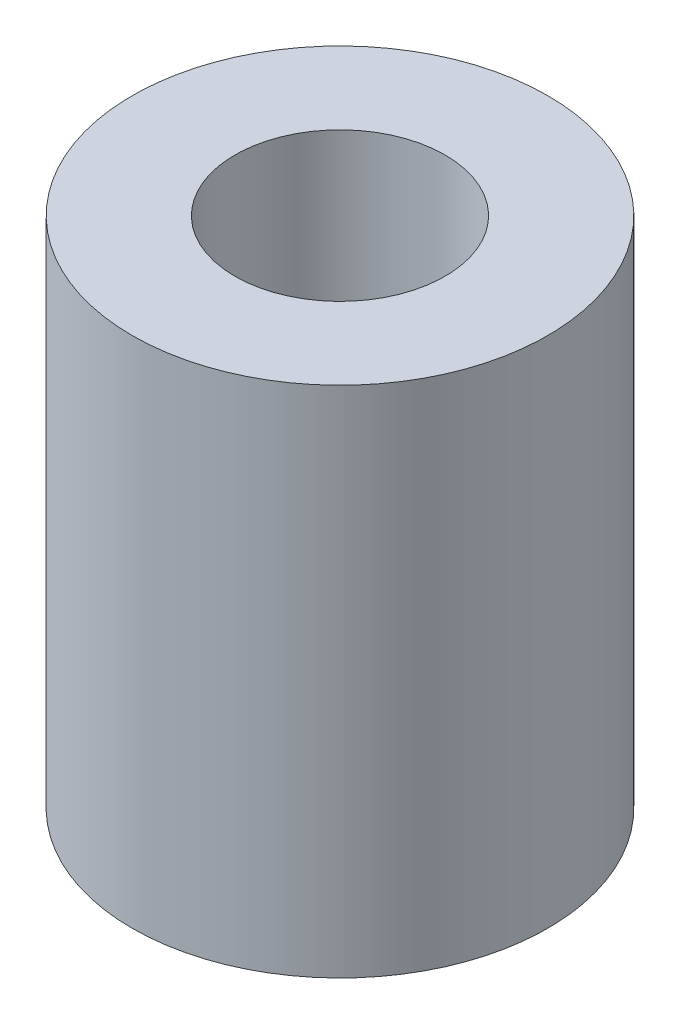
ISO-10303-21;
HEADER;
FILE_DESCRIPTION(('STEP AP214'),'2;1');
FILE_NAME('part.step','',(''),(''),'','','');
FILE_SCHEMA(('AUTOMOTIVE_DESIGN { 1 0 10303 214 1 1 1 1 }'));
ENDSEC;
DATA;
#1=APPLICATION_CONTEXT('core data for automotive mechanical design processes');
#2=APPLICATION_PROTOCOL_DEFINITION('international standard','automotive_design',2000,#1);
#3=PRODUCT_CONTEXT('',#1,'mechanical');
#4=PRODUCT('Part','Part','',(#3));
#5=PRODUCT_RELATED_PRODUCT_CATEGORY('part','',(#4));
#6=PRODUCT_DEFINITION_FORMATION('','',#4);
#7=PRODUCT_DEFINITION_CONTEXT('part definition',#1,'design');
#8=PRODUCT_DEFINITION('design','',#6,#7);
#9=PRODUCT_DEFINITION_SHAPE('','',#8);
#10=(LENGTH_UNIT() NAMED_UNIT(*) SI_UNIT(.MILLI.,.METRE.));
#11=(NAMED_UNIT(*) PLANE_ANGLE_UNIT() SI_UNIT($,.RADIAN.));
#12=(NAMED_UNIT(*) SI_UNIT($,.STERADIAN.) SOLID_ANGLE_UNIT());
#13=UNCERTAINTY_MEASURE_WITH_UNIT(LENGTH_MEASURE(1.E-05),#10,'distance_accuracy_value','');
#14=(GEOMETRIC_REPRESENTATION_CONTEXT(3) GLOBAL_UNCERTAINTY_ASSIGNED_CONTEXT((#13)) GLOBAL_UNIT_ASSIGNED_CONTEXT((#10,
#11,#12)) REPRESENTATION_CONTEXT('',''));
#15=CARTESIAN_POINT('',(0.,0.,0.));
#16=DIRECTION('',(0.,0.,1.));
#17=DIRECTION('',(1.,0.,0.));
#18=AXIS2_PLACEMENT_3D('',#15,#16,#17);
#19=CARTESIAN_POINT('',(0.,12.7,0.));
#20=DIRECTION('',(0.,1.,0.));
#21=DIRECTION('',(0.,0.,1.));
#22=AXIS2_PLACEMENT_3D('',#19,#20,#21);
#23=PLANE('',#22);
#24=CARTESIAN_POINT('',(0.,12.7,0.));
#25=DIRECTION('',(0.,1.,0.));
#26=DIRECTION('',(0.,0.,1.));
#27=AXIS2_PLACEMENT_3D('',#24,#25,#26);
#28=CIRCLE('',#27,5.14);
#29=CARTESIAN_POINT('',(0.,12.7,5.14));
#30=VERTEX_POINT('',#29);
#31=EDGE_CURVE('E10',#30,#30,#28,.T.);
#32=ORIENTED_EDGE('',*,*,#31,.T.);
#33=EDGE_LOOP('',(#32));
#34=FACE_BOUND('',#33,.T.);
#35=CARTESIAN_POINT('',(0.,12.7,0.));
#36=DIRECTION('',(0.,1.,0.));
#37=DIRECTION('',(0.,0.,1.));
#38=AXIS2_PLACEMENT_3D('',#35,#36,#37);
#39=CIRCLE('',#38,2.6);
#40=CARTESIAN_POINT('',(0.,12.7,2.6));
#41=VERTEX_POINT('',#40);
#42=EDGE_CURVE('E54',#41,#41,#39,.T.);
#43=ORIENTED_EDGE('',*,*,#42,.F.);
#44=EDGE_LOOP('',(#43));
#45=FACE_BOUND('',#44,.T.);
#46=ADVANCED_FACE('F41',(#34,#45),#23,.T.);
#47=CARTESIAN_POINT('',(0.,0.,0.));
#48=DIRECTION('',(0.,1.,0.));
#49=DIRECTION('',(0.,0.,1.));
#50=AXIS2_PLACEMENT_3D('',#47,#48,#49);
#51=PLANE('',#50);
#52=CARTESIAN_POINT('',(0.,0.,0.));
#53=DIRECTION('',(0.,1.,0.));
#54=DIRECTION('',(0.,0.,1.));
#55=AXIS2_PLACEMENT_3D('',#52,#53,#54);
#56=CIRCLE('',#55,5.14);
#57=CARTESIAN_POINT('',(0.,0.,5.14));
#58=VERTEX_POINT('',#57);
#59=EDGE_CURVE('E45',#58,#58,#56,.T.);
#60=ORIENTED_EDGE('',*,*,#59,.F.);
#61=EDGE_LOOP('',(#60));
#62=FACE_BOUND('',#61,.T.);
#63=CARTESIAN_POINT('',(0.,0.,0.));
#64=DIRECTION('',(0.,1.,0.));
#65=DIRECTION('',(0.,0.,1.));
#66=AXIS2_PLACEMENT_3D('',#63,#64,#65);
#67=CIRCLE('',#66,2.6);
#68=CARTESIAN_POINT('',(0.,0.,2.6));
#69=VERTEX_POINT('',#68);
#70=EDGE_CURVE('E56',#69,#69,#67,.T.);
#71=ORIENTED_EDGE('',*,*,#70,.T.);
#72=EDGE_LOOP('',(#71));
#73=FACE_BOUND('',#72,.T.);
#74=ADVANCED_FACE('F68',(#62,#73),#51,.F.);
#75=CARTESIAN_POINT('',(0.,12.7,0.));
#76=DIRECTION('',(0.,-1.,0.));
#77=DIRECTION('',(0.,0.,-1.));
#78=AXIS2_PLACEMENT_3D('',#75,#76,#77);
#79=CYLINDRICAL_SURFACE('',#78,5.14);
#80=ORIENTED_EDGE('',*,*,#31,.F.);
#81=EDGE_LOOP('',(#80));
#82=FACE_BOUND('',#81,.T.);
#83=ORIENTED_EDGE('',*,*,#59,.T.);
#84=EDGE_LOOP('',(#83));
#85=FACE_BOUND('',#84,.T.);
#86=ADVANCED_FACE('F43',(#82,#85),#79,.T.);
#87=CARTESIAN_POINT('',(0.,12.7,0.));
#88=DIRECTION('',(0.,-1.,0.));
#89=DIRECTION('',(0.,0.,-1.));
#90=AXIS2_PLACEMENT_3D('',#87,#88,#89);
#91=CYLINDRICAL_SURFACE('',#90,2.6);
#92=ORIENTED_EDGE('',*,*,#42,.T.);
#93=EDGE_LOOP('',(#92));
#94=FACE_BOUND('',#93,.T.);
#95=ORIENTED_EDGE('',*,*,#70,.F.);
#96=EDGE_LOOP('',(#95));
#97=FACE_BOUND('',#96,.T.);
#98=ADVANCED_FACE('F64',(#94,#97),#91,.F.);
#99=CLOSED_SHELL('',(#46,#74,#86,#98));
#100=MANIFOLD_SOLID_BREP('B2',#99);
#101=ADVANCED_BREP_SHAPE_REPRESENTATION('',(#18,#100),#14);
#102=SHAPE_DEFINITION_REPRESENTATION(#9,#101);
ENDSEC;
END-ISO-10303-21;
